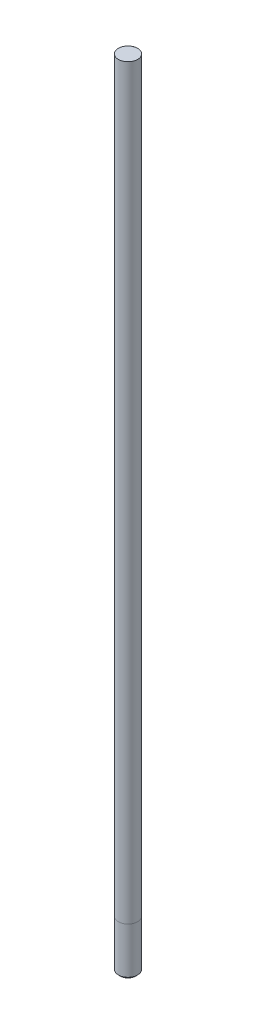
ISO-10303-21;
HEADER;
FILE_DESCRIPTION(('STEP AP214'),'2;1');
FILE_NAME('part.step','',(''),(''),'','','');
FILE_SCHEMA(('AUTOMOTIVE_DESIGN { 1 0 10303 214 1 1 1 1 }'));
ENDSEC;
DATA;
#1=APPLICATION_CONTEXT('core data for automotive mechanical design processes');
#2=APPLICATION_PROTOCOL_DEFINITION('international standard','automotive_design',2000,#1);
#3=PRODUCT_CONTEXT('',#1,'mechanical');
#4=PRODUCT('Part','Part','',(#3));
#5=PRODUCT_RELATED_PRODUCT_CATEGORY('part','',(#4));
#6=PRODUCT_DEFINITION_FORMATION('','',#4);
#7=PRODUCT_DEFINITION_CONTEXT('part definition',#1,'design');
#8=PRODUCT_DEFINITION('design','',#6,#7);
#9=PRODUCT_DEFINITION_SHAPE('','',#8);
#10=(LENGTH_UNIT() NAMED_UNIT(*) SI_UNIT(.MILLI.,.METRE.));
#11=(NAMED_UNIT(*) PLANE_ANGLE_UNIT() SI_UNIT($,.RADIAN.));
#12=(NAMED_UNIT(*) SI_UNIT($,.STERADIAN.) SOLID_ANGLE_UNIT());
#13=UNCERTAINTY_MEASURE_WITH_UNIT(LENGTH_MEASURE(1.E-05),#10,'distance_accuracy_value','');
#14=(GEOMETRIC_REPRESENTATION_CONTEXT(3) GLOBAL_UNCERTAINTY_ASSIGNED_CONTEXT((#13)) GLOBAL_UNIT_ASSIGNED_CONTEXT((#10,
#11,#12)) REPRESENTATION_CONTEXT('',''));
#15=CARTESIAN_POINT('',(0.,0.,0.));
#16=DIRECTION('',(0.,0.,1.));
#17=DIRECTION('',(1.,0.,0.));
#18=AXIS2_PLACEMENT_3D('',#15,#16,#17);
#19=CARTESIAN_POINT('',(0.,330.,0.));
#20=DIRECTION('',(0.,-1.,0.));
#21=DIRECTION('',(0.,0.,-1.));
#22=AXIS2_PLACEMENT_3D('',#19,#20,#21);
#23=CYLINDRICAL_SURFACE('',#22,4.);
#24=CARTESIAN_POINT('',(0.,20.,0.));
#25=DIRECTION('',(0.,1.,0.));
#26=DIRECTION('',(0.,0.,1.));
#27=AXIS2_PLACEMENT_3D('',#24,#25,#26);
#28=CIRCLE('',#27,4.);
#29=CARTESIAN_POINT('',(0.,20.,4.));
#30=VERTEX_POINT('',#29);
#31=EDGE_CURVE('E51',#30,#30,#28,.T.);
#32=ORIENTED_EDGE('',*,*,#31,.T.);
#33=EDGE_LOOP('',(#32));
#34=FACE_BOUND('',#33,.T.);
#35=CARTESIAN_POINT('',(0.,330.,0.));
#36=DIRECTION('',(0.,1.,0.));
#37=DIRECTION('',(0.,0.,1.));
#38=AXIS2_PLACEMENT_3D('',#35,#36,#37);
#39=CIRCLE('',#38,4.);
#40=CARTESIAN_POINT('',(0.,330.,4.));
#41=VERTEX_POINT('',#40);
#42=EDGE_CURVE('E10',#41,#41,#39,.T.);
#43=ORIENTED_EDGE('',*,*,#42,.F.);
#44=EDGE_LOOP('',(#43));
#45=FACE_BOUND('',#44,.T.);
#46=ADVANCED_FACE('F39',(#34,#45),#23,.T.);
#47=CARTESIAN_POINT('',(0.,330.,0.));
#48=DIRECTION('',(0.,1.,0.));
#49=DIRECTION('',(0.,0.,1.));
#50=AXIS2_PLACEMENT_3D('',#47,#48,#49);
#51=PLANE('',#50);
#52=ORIENTED_EDGE('',*,*,#42,.T.);
#53=EDGE_LOOP('',(#52));
#54=FACE_BOUND('',#53,.T.);
#55=ADVANCED_FACE('F82',(#54),#51,.T.);
#56=CARTESIAN_POINT('',(0.,0.,0.));
#57=DIRECTION('',(0.,1.,0.));
#58=DIRECTION('',(0.,0.,1.));
#59=AXIS2_PLACEMENT_3D('',#56,#57,#58);
#60=CYLINDRICAL_SURFACE('',#59,3.96875);
#61=CARTESIAN_POINT('',(0.,20.,0.));
#62=DIRECTION('',(0.,1.,0.));
#63=DIRECTION('',(0.,0.,1.));
#64=AXIS2_PLACEMENT_3D('',#61,#62,#63);
#65=CIRCLE('',#64,3.96875);
#66=CARTESIAN_POINT('',(0.,20.,3.96875));
#67=VERTEX_POINT('',#66);
#68=EDGE_CURVE('E46',#67,#67,#65,.T.);
#69=ORIENTED_EDGE('',*,*,#68,.F.);
#70=EDGE_LOOP('',(#69));
#71=FACE_BOUND('',#70,.T.);
#72=CARTESIAN_POINT('',(0.,0.839469999999999,0.));
#73=DIRECTION('',(0.,1.,0.));
#74=DIRECTION('',(0.,0.,1.));
#75=AXIS2_PLACEMENT_3D('',#72,#73,#74);
#76=CIRCLE('',#75,3.96875);
#77=CARTESIAN_POINT('',(0.,0.839469999999999,3.96875));
#78=VERTEX_POINT('',#77);
#79=EDGE_CURVE('E62',#78,#78,#76,.T.);
#80=ORIENTED_EDGE('',*,*,#79,.T.);
#81=EDGE_LOOP('',(#80));
#82=FACE_BOUND('',#81,.T.);
#83=ADVANCED_FACE('F67',(#71,#82),#60,.T.);
#84=CARTESIAN_POINT('',(3.96875,20.,0.));
#85=DIRECTION('',(0.,1.,0.));
#86=DIRECTION('',(0.,0.,1.));
#87=AXIS2_PLACEMENT_3D('',#84,#85,#86);
#88=PLANE('',#87);
#89=ORIENTED_EDGE('',*,*,#31,.F.);
#90=EDGE_LOOP('',(#89));
#91=FACE_BOUND('',#90,.T.);
#92=ORIENTED_EDGE('',*,*,#68,.T.);
#93=EDGE_LOOP('',(#92));
#94=FACE_BOUND('',#93,.T.);
#95=ADVANCED_FACE('F73',(#91,#94),#88,.F.);
#96=CARTESIAN_POINT('',(0.,0.,0.));
#97=DIRECTION('',(0.,1.,0.));
#98=DIRECTION('',(0.,0.,1.));
#99=AXIS2_PLACEMENT_3D('',#96,#97,#98);
#100=CONICAL_SURFACE('',#99,3.12928,0.785398163397449);
#101=ORIENTED_EDGE('',*,*,#79,.F.);
#102=EDGE_LOOP('',(#101));
#103=FACE_BOUND('',#102,.T.);
#104=CARTESIAN_POINT('',(0.,0.,0.));
#105=DIRECTION('',(0.,1.,0.));
#106=DIRECTION('',(0.,0.,1.));
#107=AXIS2_PLACEMENT_3D('',#104,#105,#106);
#108=CIRCLE('',#107,3.12928);
#109=CARTESIAN_POINT('',(0.,0.,3.12928));
#110=VERTEX_POINT('',#109);
#111=EDGE_CURVE('E56',#110,#110,#108,.T.);
#112=ORIENTED_EDGE('',*,*,#111,.T.);
#113=EDGE_LOOP('',(#112));
#114=FACE_BOUND('',#113,.T.);
#115=ADVANCED_FACE('F69',(#103,#114),#100,.T.);
#116=CARTESIAN_POINT('',(0.,0.,0.));
#117=DIRECTION('',(0.,1.,0.));
#118=DIRECTION('',(0.,0.,1.));
#119=AXIS2_PLACEMENT_3D('',#116,#117,#118);
#120=PLANE('',#119);
#121=ORIENTED_EDGE('',*,*,#111,.F.);
#122=EDGE_LOOP('',(#121));
#123=FACE_BOUND('',#122,.T.);
#124=ADVANCED_FACE('F72',(#123),#120,.F.);
#125=CLOSED_SHELL('',(#46,#55,#83,#95,#115,#124));
#126=MANIFOLD_SOLID_BREP('B2',#125);
#127=ADVANCED_BREP_SHAPE_REPRESENTATION('',(#18,#126),#14);
#128=SHAPE_DEFINITION_REPRESENTATION(#9,#127);
ENDSEC;
END-ISO-10303-21;
